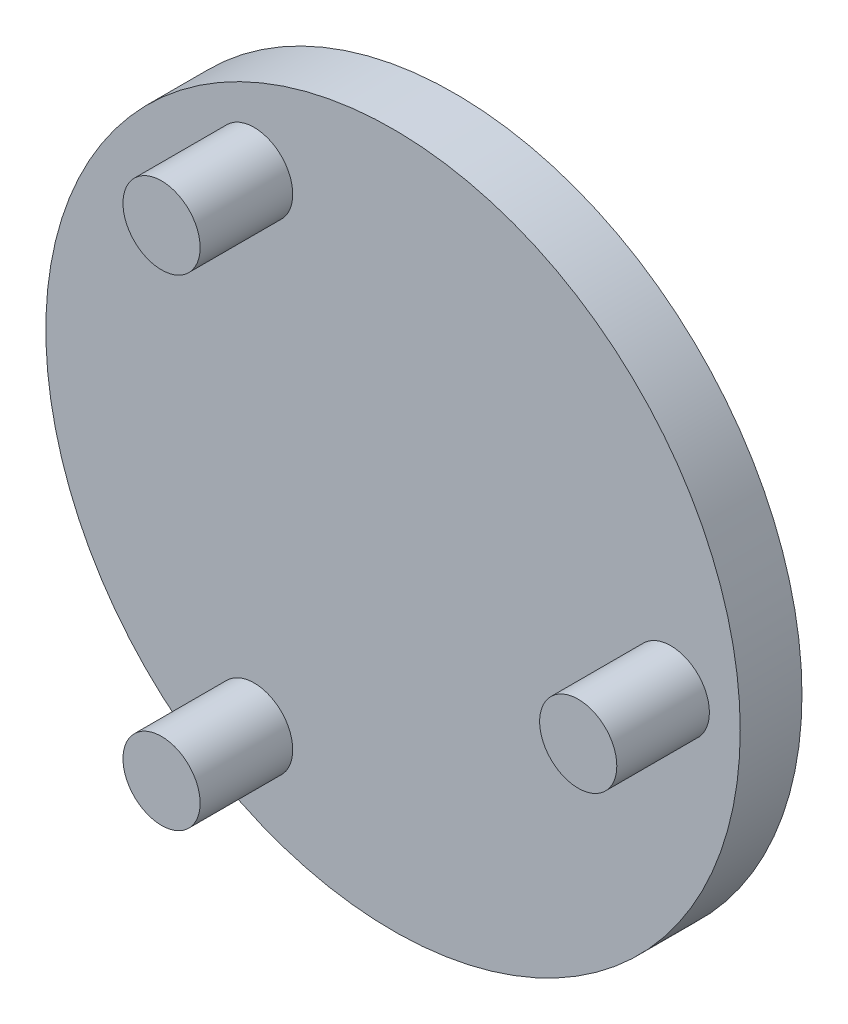
ISO-10303-21;
HEADER;
FILE_DESCRIPTION(('STEP AP214'),'2;1');
FILE_NAME('part.step','',(''),(''),'','','');
FILE_SCHEMA(('AUTOMOTIVE_DESIGN { 1 0 10303 214 1 1 1 1 }'));
ENDSEC;
DATA;
#1=APPLICATION_CONTEXT('core data for automotive mechanical design processes');
#2=APPLICATION_PROTOCOL_DEFINITION('international standard','automotive_design',2000,#1);
#3=PRODUCT_CONTEXT('',#1,'mechanical');
#4=PRODUCT('Part','Part','',(#3));
#5=PRODUCT_RELATED_PRODUCT_CATEGORY('part','',(#4));
#6=PRODUCT_DEFINITION_FORMATION('','',#4);
#7=PRODUCT_DEFINITION_CONTEXT('part definition',#1,'design');
#8=PRODUCT_DEFINITION('design','',#6,#7);
#9=PRODUCT_DEFINITION_SHAPE('','',#8);
#10=(LENGTH_UNIT() NAMED_UNIT(*) SI_UNIT(.MILLI.,.METRE.));
#11=(NAMED_UNIT(*) PLANE_ANGLE_UNIT() SI_UNIT($,.RADIAN.));
#12=(NAMED_UNIT(*) SI_UNIT($,.STERADIAN.) SOLID_ANGLE_UNIT());
#13=UNCERTAINTY_MEASURE_WITH_UNIT(LENGTH_MEASURE(1.E-05),#10,'distance_accuracy_value','');
#14=(GEOMETRIC_REPRESENTATION_CONTEXT(3) GLOBAL_UNCERTAINTY_ASSIGNED_CONTEXT((#13)) GLOBAL_UNIT_ASSIGNED_CONTEXT((#10,
#11,#12)) REPRESENTATION_CONTEXT('',''));
#15=CARTESIAN_POINT('',(0.,0.,0.));
#16=DIRECTION('',(0.,0.,1.));
#17=DIRECTION('',(1.,0.,0.));
#18=AXIS2_PLACEMENT_3D('',#15,#16,#17);
#19=CARTESIAN_POINT('',(0.,0.,8.));
#20=DIRECTION('',(0.,0.,-1.));
#21=DIRECTION('',(-1.,0.,0.));
#22=AXIS2_PLACEMENT_3D('',#19,#20,#21);
#23=CYLINDRICAL_SURFACE('',#22,45.);
#24=CARTESIAN_POINT('',(0.,0.,8.));
#25=DIRECTION('',(0.,0.,1.));
#26=DIRECTION('',(1.,0.,0.));
#27=AXIS2_PLACEMENT_3D('',#24,#25,#26);
#28=CIRCLE('',#27,45.);
#29=CARTESIAN_POINT('',(45.,0.,8.));
#30=VERTEX_POINT('',#29);
#31=EDGE_CURVE('E58',#30,#30,#28,.T.);
#32=ORIENTED_EDGE('',*,*,#31,.F.);
#33=EDGE_LOOP('',(#32));
#34=FACE_BOUND('',#33,.T.);
#35=CARTESIAN_POINT('',(0.,0.,0.));
#36=DIRECTION('',(0.,0.,1.));
#37=DIRECTION('',(1.,0.,0.));
#38=AXIS2_PLACEMENT_3D('',#35,#36,#37);
#39=CIRCLE('',#38,45.);
#40=CARTESIAN_POINT('',(45.,0.,0.));
#41=VERTEX_POINT('',#40);
#42=EDGE_CURVE('E37',#41,#41,#39,.T.);
#43=ORIENTED_EDGE('',*,*,#42,.T.);
#44=EDGE_LOOP('',(#43));
#45=FACE_BOUND('',#44,.T.);
#46=ADVANCED_FACE('F40',(#34,#45),#23,.T.);
#47=CARTESIAN_POINT('',(0.,0.,8.));
#48=DIRECTION('',(0.,0.,1.));
#49=DIRECTION('',(1.,0.,0.));
#50=AXIS2_PLACEMENT_3D('',#47,#48,#49);
#51=PLANE('',#50);
#52=CARTESIAN_POINT('',(36.,0.,8.));
#53=DIRECTION('',(0.,0.,1.));
#54=DIRECTION('',(1.,0.,0.));
#55=AXIS2_PLACEMENT_3D('',#52,#53,#54);
#56=CIRCLE('',#55,5.);
#57=CARTESIAN_POINT('',(41.,0.,8.));
#58=VERTEX_POINT('',#57);
#59=EDGE_CURVE('E10',#58,#58,#56,.T.);
#60=ORIENTED_EDGE('',*,*,#59,.F.);
#61=EDGE_LOOP('',(#60));
#62=FACE_BOUND('',#61,.T.);
#63=CARTESIAN_POINT('',(-18.,31.1769145362398,8.));
#64=DIRECTION('',(0.,0.,1.));
#65=DIRECTION('',(1.,0.,0.));
#66=AXIS2_PLACEMENT_3D('',#63,#64,#65);
#67=CIRCLE('',#66,5.);
#68=CARTESIAN_POINT('',(-13.,31.1769145362398,8.));
#69=VERTEX_POINT('',#68);
#70=EDGE_CURVE('E42',#69,#69,#67,.T.);
#71=ORIENTED_EDGE('',*,*,#70,.F.);
#72=EDGE_LOOP('',(#71));
#73=FACE_BOUND('',#72,.T.);
#74=CARTESIAN_POINT('',(-18.,-31.1769145362398,8.));
#75=DIRECTION('',(0.,0.,1.));
#76=DIRECTION('',(1.,0.,0.));
#77=AXIS2_PLACEMENT_3D('',#74,#75,#76);
#78=CIRCLE('',#77,4.99999999999998);
#79=CARTESIAN_POINT('',(-13.,-31.1769145362398,8.));
#80=VERTEX_POINT('',#79);
#81=EDGE_CURVE('E47',#80,#80,#78,.T.);
#82=ORIENTED_EDGE('',*,*,#81,.F.);
#83=EDGE_LOOP('',(#82));
#84=FACE_BOUND('',#83,.T.);
#85=ORIENTED_EDGE('',*,*,#31,.T.);
#86=EDGE_LOOP('',(#85));
#87=FACE_BOUND('',#86,.T.);
#88=ADVANCED_FACE('F87',(#62,#73,#84,#87),#51,.T.);
#89=CARTESIAN_POINT('',(0.,0.,0.));
#90=DIRECTION('',(0.,0.,1.));
#91=DIRECTION('',(1.,0.,0.));
#92=AXIS2_PLACEMENT_3D('',#89,#90,#91);
#93=PLANE('',#92);
#94=ORIENTED_EDGE('',*,*,#42,.F.);
#95=EDGE_LOOP('',(#94));
#96=FACE_BOUND('',#95,.T.);
#97=ADVANCED_FACE('F91',(#96),#93,.F.);
#98=CARTESIAN_POINT('',(-18.,-31.1769145362398,20.));
#99=DIRECTION('',(0.,0.,-1.));
#100=DIRECTION('',(-1.,0.,0.));
#101=AXIS2_PLACEMENT_3D('',#98,#99,#100);
#102=CYLINDRICAL_SURFACE('',#101,4.99999999999998);
#103=CARTESIAN_POINT('',(-18.,-31.1769145362398,20.));
#104=DIRECTION('',(0.,0.,1.));
#105=DIRECTION('',(1.,0.,0.));
#106=AXIS2_PLACEMENT_3D('',#103,#104,#105);
#107=CIRCLE('',#106,4.99999999999998);
#108=CARTESIAN_POINT('',(-13.,-31.1769145362398,20.));
#109=VERTEX_POINT('',#108);
#110=EDGE_CURVE('E60',#109,#109,#107,.T.);
#111=ORIENTED_EDGE('',*,*,#110,.F.);
#112=EDGE_LOOP('',(#111));
#113=FACE_BOUND('',#112,.T.);
#114=ORIENTED_EDGE('',*,*,#81,.T.);
#115=EDGE_LOOP('',(#114));
#116=FACE_BOUND('',#115,.T.);
#117=ADVANCED_FACE('F97',(#113,#116),#102,.T.);
#118=CARTESIAN_POINT('',(-18.,-31.1769145362398,20.));
#119=DIRECTION('',(0.,0.,1.));
#120=DIRECTION('',(1.,0.,0.));
#121=AXIS2_PLACEMENT_3D('',#118,#119,#120);
#122=PLANE('',#121);
#123=ORIENTED_EDGE('',*,*,#110,.T.);
#124=EDGE_LOOP('',(#123));
#125=FACE_BOUND('',#124,.T.);
#126=ADVANCED_FACE('F103',(#125),#122,.T.);
#127=CARTESIAN_POINT('',(-18.,31.1769145362398,20.));
#128=DIRECTION('',(0.,0.,-1.));
#129=DIRECTION('',(-1.,0.,0.));
#130=AXIS2_PLACEMENT_3D('',#127,#128,#129);
#131=CYLINDRICAL_SURFACE('',#130,5.);
#132=CARTESIAN_POINT('',(-18.,31.1769145362398,20.));
#133=DIRECTION('',(0.,0.,1.));
#134=DIRECTION('',(1.,0.,0.));
#135=AXIS2_PLACEMENT_3D('',#132,#133,#134);
#136=CIRCLE('',#135,5.);
#137=CARTESIAN_POINT('',(-13.,31.1769145362398,20.));
#138=VERTEX_POINT('',#137);
#139=EDGE_CURVE('E53',#138,#138,#136,.T.);
#140=ORIENTED_EDGE('',*,*,#139,.F.);
#141=EDGE_LOOP('',(#140));
#142=FACE_BOUND('',#141,.T.);
#143=ORIENTED_EDGE('',*,*,#70,.T.);
#144=EDGE_LOOP('',(#143));
#145=FACE_BOUND('',#144,.T.);
#146=ADVANCED_FACE('F85',(#142,#145),#131,.T.);
#147=CARTESIAN_POINT('',(-18.,31.1769145362398,20.));
#148=DIRECTION('',(0.,0.,1.));
#149=DIRECTION('',(1.,0.,0.));
#150=AXIS2_PLACEMENT_3D('',#147,#148,#149);
#151=PLANE('',#150);
#152=ORIENTED_EDGE('',*,*,#139,.T.);
#153=EDGE_LOOP('',(#152));
#154=FACE_BOUND('',#153,.T.);
#155=ADVANCED_FACE('F73',(#154),#151,.T.);
#156=CARTESIAN_POINT('',(36.,0.,20.));
#157=DIRECTION('',(0.,0.,-1.));
#158=DIRECTION('',(-1.,0.,0.));
#159=AXIS2_PLACEMENT_3D('',#156,#157,#158);
#160=CYLINDRICAL_SURFACE('',#159,5.);
#161=CARTESIAN_POINT('',(36.,0.,20.));
#162=DIRECTION('',(0.,0.,1.));
#163=DIRECTION('',(1.,0.,0.));
#164=AXIS2_PLACEMENT_3D('',#161,#162,#163);
#165=CIRCLE('',#164,5.);
#166=CARTESIAN_POINT('',(41.,0.,20.));
#167=VERTEX_POINT('',#166);
#168=EDGE_CURVE('E55',#167,#167,#165,.T.);
#169=ORIENTED_EDGE('',*,*,#168,.F.);
#170=EDGE_LOOP('',(#169));
#171=FACE_BOUND('',#170,.T.);
#172=ORIENTED_EDGE('',*,*,#59,.T.);
#173=EDGE_LOOP('',(#172));
#174=FACE_BOUND('',#173,.T.);
#175=ADVANCED_FACE('F71',(#171,#174),#160,.T.);
#176=CARTESIAN_POINT('',(36.,0.,20.));
#177=DIRECTION('',(0.,0.,1.));
#178=DIRECTION('',(1.,0.,0.));
#179=AXIS2_PLACEMENT_3D('',#176,#177,#178);
#180=PLANE('',#179);
#181=ORIENTED_EDGE('',*,*,#168,.T.);
#182=EDGE_LOOP('',(#181));
#183=FACE_BOUND('',#182,.T.);
#184=ADVANCED_FACE('F72',(#183),#180,.T.);
#185=CLOSED_SHELL('',(#46,#88,#97,#117,#126,#146,#155,#175,#184));
#186=MANIFOLD_SOLID_BREP('B2',#185);
#187=ADVANCED_BREP_SHAPE_REPRESENTATION('',(#18,#186),#14);
#188=SHAPE_DEFINITION_REPRESENTATION(#9,#187);
ENDSEC;
END-ISO-10303-21;
